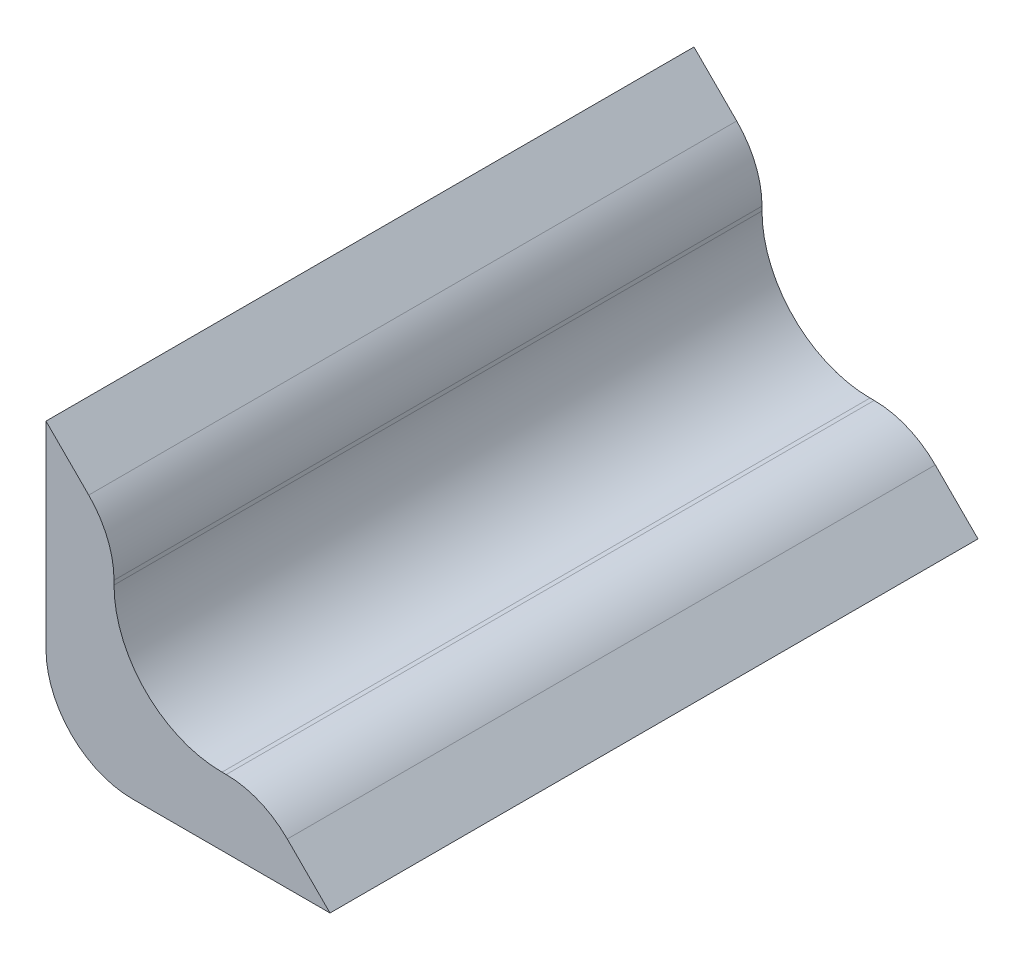
ISO-10303-21;
HEADER;
FILE_DESCRIPTION(('STEP AP214'),'2;1');
FILE_NAME('part.step','',(''),(''),'','','');
FILE_SCHEMA(('AUTOMOTIVE_DESIGN { 1 0 10303 214 1 1 1 1 }'));
ENDSEC;
DATA;
#1=APPLICATION_CONTEXT('core data for automotive mechanical design processes');
#2=APPLICATION_PROTOCOL_DEFINITION('international standard','automotive_design',2000,#1);
#3=PRODUCT_CONTEXT('',#1,'mechanical');
#4=PRODUCT('Part','Part','',(#3));
#5=PRODUCT_RELATED_PRODUCT_CATEGORY('part','',(#4));
#6=PRODUCT_DEFINITION_FORMATION('','',#4);
#7=PRODUCT_DEFINITION_CONTEXT('part definition',#1,'design');
#8=PRODUCT_DEFINITION('design','',#6,#7);
#9=PRODUCT_DEFINITION_SHAPE('','',#8);
#10=(LENGTH_UNIT() NAMED_UNIT(*) SI_UNIT(.MILLI.,.METRE.));
#11=(NAMED_UNIT(*) PLANE_ANGLE_UNIT() SI_UNIT($,.RADIAN.));
#12=(NAMED_UNIT(*) SI_UNIT($,.STERADIAN.) SOLID_ANGLE_UNIT());
#13=UNCERTAINTY_MEASURE_WITH_UNIT(LENGTH_MEASURE(1.E-05),#10,'distance_accuracy_value','');
#14=(GEOMETRIC_REPRESENTATION_CONTEXT(3) GLOBAL_UNCERTAINTY_ASSIGNED_CONTEXT((#13)) GLOBAL_UNIT_ASSIGNED_CONTEXT((#10,
#11,#12)) REPRESENTATION_CONTEXT('',''));
#15=CARTESIAN_POINT('',(0.,0.,0.));
#16=DIRECTION('',(0.,0.,1.));
#17=DIRECTION('',(1.,0.,0.));
#18=AXIS2_PLACEMENT_3D('',#15,#16,#17);
#19=CARTESIAN_POINT('',(0.,8.35,9.525));
#20=DIRECTION('',(1.,0.,0.));
#21=DIRECTION('',(0.,1.,0.));
#22=AXIS2_PLACEMENT_3D('',#19,#20,#21);
#23=PLANE('',#22);
#24=DIRECTION('',(0.,-1.,0.));
#25=VECTOR('',#24,1.);
#26=CARTESIAN_POINT('',(0.,8.35,-9.525));
#27=LINE('',#26,#25);
#28=CARTESIAN_POINT('',(0.,8.35,-9.525));
#29=VERTEX_POINT('',#28);
#30=CARTESIAN_POINT('',(0.,2.54,-9.525));
#31=VERTEX_POINT('',#30);
#32=EDGE_CURVE('E242',#29,#31,#27,.T.);
#33=ORIENTED_EDGE('',*,*,#32,.T.);
#34=DIRECTION('',(0.,0.,-1.));
#35=VECTOR('',#34,1.);
#36=CARTESIAN_POINT('',(0.,2.54,9.525));
#37=LINE('',#36,#35);
#38=CARTESIAN_POINT('',(0.,2.54,9.525));
#39=VERTEX_POINT('',#38);
#40=EDGE_CURVE('E196',#31,#39,#37,.F.);
#41=ORIENTED_EDGE('',*,*,#40,.T.);
#42=DIRECTION('',(0.,-1.,0.));
#43=VECTOR('',#42,1.);
#44=CARTESIAN_POINT('',(0.,8.35,9.525));
#45=LINE('',#44,#43);
#46=CARTESIAN_POINT('',(0.,8.35,9.525));
#47=VERTEX_POINT('',#46);
#48=EDGE_CURVE('E139',#47,#39,#45,.T.);
#49=ORIENTED_EDGE('',*,*,#48,.F.);
#50=DIRECTION('',(0.,0.,-1.));
#51=VECTOR('',#50,1.);
#52=CARTESIAN_POINT('',(0.,8.35,9.525));
#53=LINE('',#52,#51);
#54=EDGE_CURVE('E151',#47,#29,#53,.T.);
#55=ORIENTED_EDGE('',*,*,#54,.T.);
#56=EDGE_LOOP('',(#33,#41,#49,#55));
#57=FACE_BOUND('',#56,.T.);
#58=ADVANCED_FACE('F47',(#57),#23,.F.);
#59=CARTESIAN_POINT('',(0.,0.,9.525));
#60=DIRECTION('',(0.,1.,0.));
#61=DIRECTION('',(0.,0.,1.));
#62=AXIS2_PLACEMENT_3D('',#59,#60,#61);
#63=PLANE('',#62);
#64=DIRECTION('',(1.,0.,0.));
#65=VECTOR('',#64,1.);
#66=CARTESIAN_POINT('',(0.,0.,9.525));
#67=LINE('',#66,#65);
#68=CARTESIAN_POINT('',(2.54,0.,9.525));
#69=VERTEX_POINT('',#68);
#70=CARTESIAN_POINT('',(8.35,0.,9.525));
#71=VERTEX_POINT('',#70);
#72=EDGE_CURVE('E125',#69,#71,#67,.T.);
#73=ORIENTED_EDGE('',*,*,#72,.F.);
#74=DIRECTION('',(0.,0.,-1.));
#75=VECTOR('',#74,1.);
#76=CARTESIAN_POINT('',(2.54,0.,9.525));
#77=LINE('',#76,#75);
#78=CARTESIAN_POINT('',(2.54,0.,-9.525));
#79=VERTEX_POINT('',#78);
#80=EDGE_CURVE('E190',#69,#79,#77,.T.);
#81=ORIENTED_EDGE('',*,*,#80,.T.);
#82=DIRECTION('',(1.,0.,0.));
#83=VECTOR('',#82,1.);
#84=CARTESIAN_POINT('',(0.,0.,-9.525));
#85=LINE('',#84,#83);
#86=CARTESIAN_POINT('',(8.35,0.,-9.525));
#87=VERTEX_POINT('',#86);
#88=EDGE_CURVE('E145',#79,#87,#85,.T.);
#89=ORIENTED_EDGE('',*,*,#88,.T.);
#90=DIRECTION('',(0.,0.,-1.));
#91=VECTOR('',#90,1.);
#92=CARTESIAN_POINT('',(8.35,0.,9.525));
#93=LINE('',#92,#91);
#94=EDGE_CURVE('E142',#71,#87,#93,.T.);
#95=ORIENTED_EDGE('',*,*,#94,.F.);
#96=EDGE_LOOP('',(#73,#81,#89,#95));
#97=FACE_BOUND('',#96,.T.);
#98=ADVANCED_FACE('F143',(#97),#63,.F.);
#99=CARTESIAN_POINT('',(8.35,2.,9.525));
#100=DIRECTION('',(0.,-1.,0.));
#101=DIRECTION('',(1.,0.,0.));
#102=AXIS2_PLACEMENT_3D('',#99,#100,#101);
#103=PLANE('',#102);
#104=DIRECTION('',(-1.,0.,0.));
#105=VECTOR('',#104,1.);
#106=CARTESIAN_POINT('',(8.35,2.,-9.525));
#107=LINE('',#106,#105);
#108=CARTESIAN_POINT('',(5.29789755157234,2.,-9.525));
#109=VERTEX_POINT('',#108);
#110=CARTESIAN_POINT('',(5.175,2.,-9.525));
#111=VERTEX_POINT('',#110);
#112=EDGE_CURVE('E220',#109,#111,#107,.T.);
#113=ORIENTED_EDGE('',*,*,#112,.T.);
#114=DIRECTION('',(0.,0.,-1.));
#115=VECTOR('',#114,1.);
#116=CARTESIAN_POINT('',(5.175,2.,9.525));
#117=LINE('',#116,#115);
#118=CARTESIAN_POINT('',(5.175,2.,9.525));
#119=VERTEX_POINT('',#118);
#120=EDGE_CURVE('E69',#111,#119,#117,.F.);
#121=ORIENTED_EDGE('',*,*,#120,.T.);
#122=DIRECTION('',(-1.,0.,0.));
#123=VECTOR('',#122,1.);
#124=CARTESIAN_POINT('',(8.35,2.,9.525));
#125=LINE('',#124,#123);
#126=CARTESIAN_POINT('',(5.29789755157234,2.,9.525));
#127=VERTEX_POINT('',#126);
#128=EDGE_CURVE('E138',#127,#119,#125,.T.);
#129=ORIENTED_EDGE('',*,*,#128,.F.);
#130=DIRECTION('',(0.,0.,1.));
#131=VECTOR('',#130,1.);
#132=CARTESIAN_POINT('',(5.29789755157234,2.,-9.525));
#133=LINE('',#132,#131);
#134=EDGE_CURVE('E157',#127,#109,#133,.F.);
#135=ORIENTED_EDGE('',*,*,#134,.T.);
#136=EDGE_LOOP('',(#113,#121,#129,#135));
#137=FACE_BOUND('',#136,.T.);
#138=ADVANCED_FACE('F236',(#137),#103,.F.);
#139=CARTESIAN_POINT('',(2.,2.,9.525));
#140=DIRECTION('',(-1.,0.,0.));
#141=DIRECTION('',(0.,-1.,0.));
#142=AXIS2_PLACEMENT_3D('',#139,#140,#141);
#143=PLANE('',#142);
#144=DIRECTION('',(0.,1.,0.));
#145=VECTOR('',#144,1.);
#146=CARTESIAN_POINT('',(2.,2.,9.525));
#147=LINE('',#146,#145);
#148=CARTESIAN_POINT('',(2.,5.175,9.525));
#149=VERTEX_POINT('',#148);
#150=CARTESIAN_POINT('',(2.,5.29789755157234,9.525));
#151=VERTEX_POINT('',#150);
#152=EDGE_CURVE('E212',#149,#151,#147,.T.);
#153=ORIENTED_EDGE('',*,*,#152,.F.);
#154=DIRECTION('',(0.,0.,-1.));
#155=VECTOR('',#154,1.);
#156=CARTESIAN_POINT('',(2.,5.175,-9.525));
#157=LINE('',#156,#155);
#158=CARTESIAN_POINT('',(2.,5.175,-9.525));
#159=VERTEX_POINT('',#158);
#160=EDGE_CURVE('E201',#149,#159,#157,.T.);
#161=ORIENTED_EDGE('',*,*,#160,.T.);
#162=DIRECTION('',(0.,1.,0.));
#163=VECTOR('',#162,1.);
#164=CARTESIAN_POINT('',(2.,2.,-9.525));
#165=LINE('',#164,#163);
#166=CARTESIAN_POINT('',(2.,5.29789755157234,-9.525));
#167=VERTEX_POINT('',#166);
#168=EDGE_CURVE('E211',#159,#167,#165,.T.);
#169=ORIENTED_EDGE('',*,*,#168,.T.);
#170=DIRECTION('',(0.,0.,-1.));
#171=VECTOR('',#170,1.);
#172=CARTESIAN_POINT('',(2.,5.29789755157234,9.525));
#173=LINE('',#172,#171);
#174=EDGE_CURVE('E183',#167,#151,#173,.F.);
#175=ORIENTED_EDGE('',*,*,#174,.T.);
#176=EDGE_LOOP('',(#153,#161,#169,#175));
#177=FACE_BOUND('',#176,.T.);
#178=ADVANCED_FACE('F210',(#177),#143,.F.);
#179=CARTESIAN_POINT('',(0.,0.,9.525));
#180=DIRECTION('',(0.,0.,1.));
#181=DIRECTION('',(1.,0.,0.));
#182=AXIS2_PLACEMENT_3D('',#179,#180,#181);
#183=PLANE('',#182);
#184=ORIENTED_EDGE('',*,*,#48,.T.);
#185=CARTESIAN_POINT('',(2.54,2.54,9.525));
#186=DIRECTION('',(0.,0.,1.));
#187=DIRECTION('',(1.,0.,0.));
#188=AXIS2_PLACEMENT_3D('',#185,#186,#187);
#189=CIRCLE('',#188,2.54);
#190=EDGE_CURVE('E133',#39,#69,#189,.T.);
#191=ORIENTED_EDGE('',*,*,#190,.T.);
#192=ORIENTED_EDGE('',*,*,#72,.T.);
#193=DIRECTION('',(0.707106781186547,-0.707106781186548,0.));
#194=VECTOR('',#193,1.);
#195=CARTESIAN_POINT('',(4.17500000000001,4.175,9.525));
#196=LINE('',#195,#194);
#197=CARTESIAN_POINT('',(7.09394877578617,1.25605122421383,9.525));
#198=VERTEX_POINT('',#197);
#199=EDGE_CURVE('E130',#71,#198,#196,.F.);
#200=ORIENTED_EDGE('',*,*,#199,.T.);
#201=CARTESIAN_POINT('',(5.29789755157234,-0.54,9.525));
#202=DIRECTION('',(0.,0.,1.));
#203=DIRECTION('',(1.,0.,0.));
#204=AXIS2_PLACEMENT_3D('',#201,#202,#203);
#205=CIRCLE('',#204,2.54);
#206=EDGE_CURVE('E180',#198,#127,#205,.T.);
#207=ORIENTED_EDGE('',*,*,#206,.T.);
#208=ORIENTED_EDGE('',*,*,#128,.T.);
#209=CARTESIAN_POINT('',(5.175,5.175,9.525));
#210=DIRECTION('',(0.,0.,1.));
#211=DIRECTION('',(1.,0.,0.));
#212=AXIS2_PLACEMENT_3D('',#209,#210,#211);
#213=CIRCLE('',#212,3.175);
#214=EDGE_CURVE('E11',#119,#149,#213,.F.);
#215=ORIENTED_EDGE('',*,*,#214,.T.);
#216=ORIENTED_EDGE('',*,*,#152,.T.);
#217=CARTESIAN_POINT('',(-0.540000000000002,5.29789755157234,9.525));
#218=DIRECTION('',(0.,0.,1.));
#219=DIRECTION('',(1.,0.,0.));
#220=AXIS2_PLACEMENT_3D('',#217,#218,#219);
#221=CIRCLE('',#220,2.54);
#222=CARTESIAN_POINT('',(1.25605122421383,7.09394877578617,9.525));
#223=VERTEX_POINT('',#222);
#224=EDGE_CURVE('E177',#151,#223,#221,.T.);
#225=ORIENTED_EDGE('',*,*,#224,.T.);
#226=DIRECTION('',(0.707106781186547,-0.707106781186548,0.));
#227=VECTOR('',#226,1.);
#228=CARTESIAN_POINT('',(4.175,4.17499999999999,9.525));
#229=LINE('',#228,#227);
#230=EDGE_CURVE('E158',#223,#47,#229,.F.);
#231=ORIENTED_EDGE('',*,*,#230,.T.);
#232=EDGE_LOOP('',(#184,#191,#192,#200,#207,#208,#215,#216,#225,#231));
#233=FACE_BOUND('',#232,.T.);
#234=ADVANCED_FACE('F128',(#233),#183,.T.);
#235=CARTESIAN_POINT('',(0.,0.,-9.525));
#236=DIRECTION('',(0.,0.,1.));
#237=DIRECTION('',(1.,0.,0.));
#238=AXIS2_PLACEMENT_3D('',#235,#236,#237);
#239=PLANE('',#238);
#240=ORIENTED_EDGE('',*,*,#88,.F.);
#241=CARTESIAN_POINT('',(2.54,2.54,-9.525));
#242=DIRECTION('',(0.,0.,1.));
#243=DIRECTION('',(1.,0.,0.));
#244=AXIS2_PLACEMENT_3D('',#241,#242,#243);
#245=CIRCLE('',#244,2.54);
#246=EDGE_CURVE('E193',#79,#31,#245,.F.);
#247=ORIENTED_EDGE('',*,*,#246,.T.);
#248=ORIENTED_EDGE('',*,*,#32,.F.);
#249=DIRECTION('',(-0.707106781186547,0.707106781186548,0.));
#250=VECTOR('',#249,1.);
#251=CARTESIAN_POINT('',(0.,8.35,-9.525));
#252=LINE('',#251,#250);
#253=CARTESIAN_POINT('',(1.25605122421383,7.09394877578617,-9.525));
#254=VERTEX_POINT('',#253);
#255=EDGE_CURVE('E150',#29,#254,#252,.F.);
#256=ORIENTED_EDGE('',*,*,#255,.T.);
#257=CARTESIAN_POINT('',(-0.540000000000002,5.29789755157234,-9.525));
#258=DIRECTION('',(0.,0.,1.));
#259=DIRECTION('',(1.,0.,0.));
#260=AXIS2_PLACEMENT_3D('',#257,#258,#259);
#261=CIRCLE('',#260,2.54);
#262=EDGE_CURVE('E163',#254,#167,#261,.F.);
#263=ORIENTED_EDGE('',*,*,#262,.T.);
#264=ORIENTED_EDGE('',*,*,#168,.F.);
#265=CARTESIAN_POINT('',(5.175,5.175,-9.525));
#266=DIRECTION('',(0.,0.,1.));
#267=DIRECTION('',(1.,0.,0.));
#268=AXIS2_PLACEMENT_3D('',#265,#266,#267);
#269=CIRCLE('',#268,3.175);
#270=EDGE_CURVE('E56',#159,#111,#269,.T.);
#271=ORIENTED_EDGE('',*,*,#270,.T.);
#272=ORIENTED_EDGE('',*,*,#112,.F.);
#273=CARTESIAN_POINT('',(5.29789755157234,-0.54,-9.525));
#274=DIRECTION('',(0.,0.,1.));
#275=DIRECTION('',(1.,0.,0.));
#276=AXIS2_PLACEMENT_3D('',#273,#274,#275);
#277=CIRCLE('',#276,2.54);
#278=CARTESIAN_POINT('',(7.09394877578617,1.25605122421383,-9.525));
#279=VERTEX_POINT('',#278);
#280=EDGE_CURVE('E172',#109,#279,#277,.F.);
#281=ORIENTED_EDGE('',*,*,#280,.T.);
#282=DIRECTION('',(-0.707106781186547,0.707106781186548,0.));
#283=VECTOR('',#282,1.);
#284=CARTESIAN_POINT('',(6.35,2.,-9.525));
#285=LINE('',#284,#283);
#286=EDGE_CURVE('E165',#279,#87,#285,.F.);
#287=ORIENTED_EDGE('',*,*,#286,.T.);
#288=EDGE_LOOP('',(#240,#247,#248,#256,#263,#264,#271,#272,#281,#287));
#289=FACE_BOUND('',#288,.T.);
#290=ADVANCED_FACE('F215',(#289),#239,.F.);
#291=CARTESIAN_POINT('',(6.35,2.,9.525));
#292=DIRECTION('',(-0.707106781186548,-0.707106781186547,0.));
#293=DIRECTION('',(0.,0.,-1.));
#294=AXIS2_PLACEMENT_3D('',#291,#292,#293);
#295=PLANE('',#294);
#296=ORIENTED_EDGE('',*,*,#286,.F.);
#297=DIRECTION('',(0.,0.,-1.));
#298=VECTOR('',#297,1.);
#299=CARTESIAN_POINT('',(7.09394877578617,1.25605122421383,9.525));
#300=LINE('',#299,#298);
#301=EDGE_CURVE('E155',#279,#198,#300,.F.);
#302=ORIENTED_EDGE('',*,*,#301,.T.);
#303=ORIENTED_EDGE('',*,*,#199,.F.);
#304=ORIENTED_EDGE('',*,*,#94,.T.);
#305=EDGE_LOOP('',(#296,#302,#303,#304));
#306=FACE_BOUND('',#305,.T.);
#307=ADVANCED_FACE('F153',(#306),#295,.F.);
#308=CARTESIAN_POINT('',(0.,8.35,9.525));
#309=DIRECTION('',(-0.707106781186548,-0.707106781186547,0.));
#310=DIRECTION('',(0.,0.,-1.));
#311=AXIS2_PLACEMENT_3D('',#308,#309,#310);
#312=PLANE('',#311);
#313=ORIENTED_EDGE('',*,*,#230,.F.);
#314=DIRECTION('',(0.,0.,1.));
#315=VECTOR('',#314,1.);
#316=CARTESIAN_POINT('',(1.25605122421383,7.09394877578617,-9.525));
#317=LINE('',#316,#315);
#318=EDGE_CURVE('E187',#223,#254,#317,.F.);
#319=ORIENTED_EDGE('',*,*,#318,.T.);
#320=ORIENTED_EDGE('',*,*,#255,.F.);
#321=ORIENTED_EDGE('',*,*,#54,.F.);
#322=EDGE_LOOP('',(#313,#319,#320,#321));
#323=FACE_BOUND('',#322,.T.);
#324=ADVANCED_FACE('F276',(#323),#312,.F.);
#325=CARTESIAN_POINT('',(5.29789755157234,-0.54,9.525));
#326=DIRECTION('',(0.,0.,-1.));
#327=DIRECTION('',(-1.,0.,0.));
#328=AXIS2_PLACEMENT_3D('',#325,#326,#327);
#329=CYLINDRICAL_SURFACE('',#328,2.54);
#330=ORIENTED_EDGE('',*,*,#206,.F.);
#331=ORIENTED_EDGE('',*,*,#301,.F.);
#332=ORIENTED_EDGE('',*,*,#280,.F.);
#333=ORIENTED_EDGE('',*,*,#134,.F.);
#334=EDGE_LOOP('',(#330,#331,#332,#333));
#335=FACE_BOUND('',#334,.T.);
#336=ADVANCED_FACE('F234',(#335),#329,.T.);
#337=CARTESIAN_POINT('',(-0.540000000000002,5.29789755157234,9.525));
#338=DIRECTION('',(0.,0.,1.));
#339=DIRECTION('',(1.,0.,0.));
#340=AXIS2_PLACEMENT_3D('',#337,#338,#339);
#341=CYLINDRICAL_SURFACE('',#340,2.54);
#342=ORIENTED_EDGE('',*,*,#262,.F.);
#343=ORIENTED_EDGE('',*,*,#318,.F.);
#344=ORIENTED_EDGE('',*,*,#224,.F.);
#345=ORIENTED_EDGE('',*,*,#174,.F.);
#346=EDGE_LOOP('',(#342,#343,#344,#345));
#347=FACE_BOUND('',#346,.T.);
#348=ADVANCED_FACE('F254',(#347),#341,.T.);
#349=CARTESIAN_POINT('',(2.54,2.54,9.525));
#350=DIRECTION('',(0.,0.,-1.));
#351=DIRECTION('',(-1.,0.,0.));
#352=AXIS2_PLACEMENT_3D('',#349,#350,#351);
#353=CYLINDRICAL_SURFACE('',#352,2.54);
#354=ORIENTED_EDGE('',*,*,#190,.F.);
#355=ORIENTED_EDGE('',*,*,#40,.F.);
#356=ORIENTED_EDGE('',*,*,#246,.F.);
#357=ORIENTED_EDGE('',*,*,#80,.F.);
#358=EDGE_LOOP('',(#354,#355,#356,#357));
#359=FACE_BOUND('',#358,.T.);
#360=ADVANCED_FACE('F252',(#359),#353,.T.);
#361=CARTESIAN_POINT('',(5.175,5.175,9.525));
#362=DIRECTION('',(0.,0.,1.));
#363=DIRECTION('',(1.,0.,0.));
#364=AXIS2_PLACEMENT_3D('',#361,#362,#363);
#365=CYLINDRICAL_SURFACE('',#364,3.175);
#366=ORIENTED_EDGE('',*,*,#214,.F.);
#367=ORIENTED_EDGE('',*,*,#120,.F.);
#368=ORIENTED_EDGE('',*,*,#270,.F.);
#369=ORIENTED_EDGE('',*,*,#160,.F.);
#370=EDGE_LOOP('',(#366,#367,#368,#369));
#371=FACE_BOUND('',#370,.T.);
#372=ADVANCED_FACE('F49',(#371),#365,.F.);
#373=CLOSED_SHELL('',(#58,#98,#138,#178,#234,#290,#307,#324,#336,#348,#360,#372));
#374=MANIFOLD_SOLID_BREP('B2',#373);
#375=ADVANCED_BREP_SHAPE_REPRESENTATION('',(#18,#374),#14);
#376=SHAPE_DEFINITION_REPRESENTATION(#9,#375);
ENDSEC;
END-ISO-10303-21;
